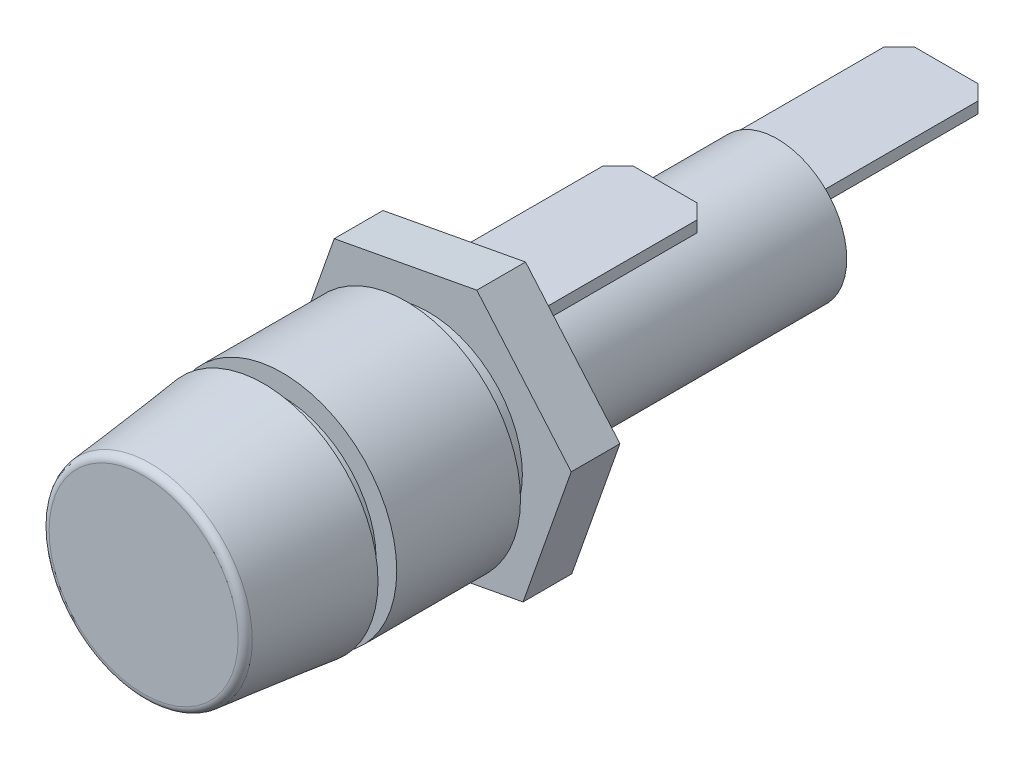
ISO-10303-21;
HEADER;
FILE_DESCRIPTION(('STEP AP214'),'2;1');
FILE_NAME('part.step','',(''),(''),'','','');
FILE_SCHEMA(('AUTOMOTIVE_DESIGN { 1 0 10303 214 1 1 1 1 }'));
ENDSEC;
DATA;
#1=APPLICATION_CONTEXT('core data for automotive mechanical design processes');
#2=APPLICATION_PROTOCOL_DEFINITION('international standard','automotive_design',2000,#1);
#3=PRODUCT_CONTEXT('',#1,'mechanical');
#4=PRODUCT('Part','Part','',(#3));
#5=PRODUCT_RELATED_PRODUCT_CATEGORY('part','',(#4));
#6=PRODUCT_DEFINITION_FORMATION('','',#4);
#7=PRODUCT_DEFINITION_CONTEXT('part definition',#1,'design');
#8=PRODUCT_DEFINITION('design','',#6,#7);
#9=PRODUCT_DEFINITION_SHAPE('','',#8);
#10=(LENGTH_UNIT() NAMED_UNIT(*) SI_UNIT(.MILLI.,.METRE.));
#11=(NAMED_UNIT(*) PLANE_ANGLE_UNIT() SI_UNIT($,.RADIAN.));
#12=(NAMED_UNIT(*) SI_UNIT($,.STERADIAN.) SOLID_ANGLE_UNIT());
#13=UNCERTAINTY_MEASURE_WITH_UNIT(LENGTH_MEASURE(1.E-05),#10,'distance_accuracy_value','');
#14=(GEOMETRIC_REPRESENTATION_CONTEXT(3) GLOBAL_UNCERTAINTY_ASSIGNED_CONTEXT((#13)) GLOBAL_UNIT_ASSIGNED_CONTEXT((#10,
#11,#12)) REPRESENTATION_CONTEXT('',''));
#15=CARTESIAN_POINT('',(0.,0.,0.));
#16=DIRECTION('',(0.,0.,1.));
#17=DIRECTION('',(1.,0.,0.));
#18=AXIS2_PLACEMENT_3D('',#15,#16,#17);
#19=CARTESIAN_POINT('',(6.35,0.,-6.096));
#20=DIRECTION('',(0.,0.,-1.));
#21=DIRECTION('',(-1.,0.,0.));
#22=AXIS2_PLACEMENT_3D('',#19,#20,#21);
#23=PLANE('',#22);
#24=CARTESIAN_POINT('',(0.,0.,-6.096));
#25=DIRECTION('',(0.,0.,1.));
#26=DIRECTION('',(1.,0.,0.));
#27=AXIS2_PLACEMENT_3D('',#24,#25,#26);
#28=CIRCLE('',#27,4.699);
#29=CARTESIAN_POINT('',(4.699,0.,-6.096));
#30=VERTEX_POINT('',#29);
#31=EDGE_CURVE('E310',#30,#30,#28,.T.);
#32=ORIENTED_EDGE('',*,*,#31,.T.);
#33=EDGE_LOOP('',(#32));
#34=FACE_BOUND('',#33,.T.);
#35=DIRECTION('',(-1.,0.,0.));
#36=VECTOR('',#35,1.);
#37=CARTESIAN_POINT('',(3.175,5.08,-6.09600000001365));
#38=LINE('',#37,#36);
#39=CARTESIAN_POINT('',(3.175,5.08,-6.09600000001365));
#40=VERTEX_POINT('',#39);
#41=CARTESIAN_POINT('',(-3.175,5.08,-6.09600000001365));
#42=VERTEX_POINT('',#41);
#43=EDGE_CURVE('E172',#40,#42,#38,.T.);
#44=ORIENTED_EDGE('',*,*,#43,.F.);
#45=DIRECTION('',(0.,-1.,0.));
#46=VECTOR('',#45,1.);
#47=CARTESIAN_POINT('',(3.175,5.08,-6.09600000001365));
#48=LINE('',#47,#46);
#49=CARTESIAN_POINT('',(3.175,5.49926131403118,-6.09600000001365));
#50=VERTEX_POINT('',#49);
#51=EDGE_CURVE('E183',#50,#40,#48,.T.);
#52=ORIENTED_EDGE('',*,*,#51,.F.);
#53=CARTESIAN_POINT('',(0.,0.,-6.096));
#54=DIRECTION('',(0.,0.,1.));
#55=DIRECTION('',(1.,0.,0.));
#56=AXIS2_PLACEMENT_3D('',#53,#54,#55);
#57=CIRCLE('',#56,6.35);
#58=CARTESIAN_POINT('',(-3.175,5.49926131403118,-6.09600000001365));
#59=VERTEX_POINT('',#58);
#60=EDGE_CURVE('E306',#59,#50,#57,.T.);
#61=ORIENTED_EDGE('',*,*,#60,.F.);
#62=DIRECTION('',(0.,1.,0.));
#63=VECTOR('',#62,1.);
#64=CARTESIAN_POINT('',(-3.175,5.08,-6.09600000001365));
#65=LINE('',#64,#63);
#66=EDGE_CURVE('E192',#42,#59,#65,.T.);
#67=ORIENTED_EDGE('',*,*,#66,.F.);
#68=EDGE_LOOP('',(#44,#52,#61,#67));
#69=FACE_BOUND('',#68,.T.);
#70=ADVANCED_FACE('F30',(#34,#69),#23,.T.);
#71=CARTESIAN_POINT('',(2.48868157866771,5.842,-6.096));
#72=VERTEX_POINT('',#71);
#73=CARTESIAN_POINT('',(-2.48868157866771,5.842,-6.09600000001365));
#74=VERTEX_POINT('',#73);
#75=EDGE_CURVE('E311',#72,#74,#57,.T.);
#76=ORIENTED_EDGE('',*,*,#75,.F.);
#77=DIRECTION('',(1.,0.,0.));
#78=VECTOR('',#77,1.);
#79=CARTESIAN_POINT('',(3.175,5.842,-6.09600000001365));
#80=LINE('',#79,#78);
#81=EDGE_CURVE('E203',#74,#72,#80,.T.);
#82=ORIENTED_EDGE('',*,*,#81,.F.);
#83=EDGE_LOOP('',(#76,#82));
#84=FACE_BOUND('',#83,.T.);
#85=ADVANCED_FACE('F389',(#84),#23,.T.);
#86=CARTESIAN_POINT('',(4.699,0.,-25.146));
#87=DIRECTION('',(0.,0.,-1.));
#88=DIRECTION('',(-1.,0.,0.));
#89=AXIS2_PLACEMENT_3D('',#86,#87,#88);
#90=PLANE('',#89);
#91=CARTESIAN_POINT('',(0.,0.,-25.146));
#92=DIRECTION('',(0.,0.,1.));
#93=DIRECTION('',(1.,0.,0.));
#94=AXIS2_PLACEMENT_3D('',#91,#92,#93);
#95=CIRCLE('',#94,4.699);
#96=CARTESIAN_POINT('',(4.699,0.,-25.146));
#97=VERTEX_POINT('',#96);
#98=EDGE_CURVE('E314',#97,#97,#95,.T.);
#99=ORIENTED_EDGE('',*,*,#98,.F.);
#100=EDGE_LOOP('',(#99));
#101=FACE_BOUND('',#100,.T.);
#102=DIRECTION('',(-1.,0.,0.));
#103=VECTOR('',#102,1.);
#104=CARTESIAN_POINT('',(3.175,2.54,-25.146));
#105=LINE('',#104,#103);
#106=CARTESIAN_POINT('',(3.175,2.54,-25.146));
#107=VERTEX_POINT('',#106);
#108=CARTESIAN_POINT('',(-3.175,2.54,-25.146));
#109=VERTEX_POINT('',#108);
#110=EDGE_CURVE('E216',#107,#109,#105,.T.);
#111=ORIENTED_EDGE('',*,*,#110,.F.);
#112=DIRECTION('',(0.,-1.,0.));
#113=VECTOR('',#112,1.);
#114=CARTESIAN_POINT('',(3.175,2.54,-25.146));
#115=LINE('',#114,#113);
#116=CARTESIAN_POINT('',(3.175,3.302,-25.146));
#117=VERTEX_POINT('',#116);
#118=EDGE_CURVE('E178',#117,#107,#115,.T.);
#119=ORIENTED_EDGE('',*,*,#118,.F.);
#120=DIRECTION('',(1.,0.,0.));
#121=VECTOR('',#120,1.);
#122=CARTESIAN_POINT('',(3.175,3.302,-25.146));
#123=LINE('',#122,#121);
#124=CARTESIAN_POINT('',(-3.175,3.302,-25.146));
#125=VERTEX_POINT('',#124);
#126=EDGE_CURVE('E222',#125,#117,#123,.T.);
#127=ORIENTED_EDGE('',*,*,#126,.F.);
#128=DIRECTION('',(0.,1.,0.));
#129=VECTOR('',#128,1.);
#130=CARTESIAN_POINT('',(-3.175,2.54,-25.146));
#131=LINE('',#130,#129);
#132=EDGE_CURVE('E219',#109,#125,#131,.T.);
#133=ORIENTED_EDGE('',*,*,#132,.F.);
#134=EDGE_LOOP('',(#111,#119,#127,#133));
#135=FACE_BOUND('',#134,.T.);
#136=ADVANCED_FACE('F32',(#101,#135),#90,.T.);
#137=CARTESIAN_POINT('',(0.,0.,0.));
#138=DIRECTION('',(0.,0.,1.));
#139=DIRECTION('',(1.,0.,0.));
#140=AXIS2_PLACEMENT_3D('',#137,#138,#139);
#141=CYLINDRICAL_SURFACE('',#140,6.35);
#142=CARTESIAN_POINT('',(0.,0.,-1.524));
#143=DIRECTION('',(0.,0.,1.));
#144=DIRECTION('',(1.,0.,0.));
#145=AXIS2_PLACEMENT_3D('',#142,#143,#144);
#146=CIRCLE('',#145,6.35);
#147=CARTESIAN_POINT('',(6.35,0.,-1.524));
#148=VERTEX_POINT('',#147);
#149=EDGE_CURVE('E317',#148,#148,#146,.F.);
#150=ORIENTED_EDGE('',*,*,#149,.F.);
#151=EDGE_LOOP('',(#150));
#152=FACE_BOUND('',#151,.T.);
#153=CARTESIAN_POINT('',(0.,0.,0.));
#154=DIRECTION('',(0.,0.,1.));
#155=DIRECTION('',(1.,0.,0.));
#156=AXIS2_PLACEMENT_3D('',#153,#154,#155);
#157=CIRCLE('',#156,6.35);
#158=CARTESIAN_POINT('',(6.35,0.,0.));
#159=VERTEX_POINT('',#158);
#160=EDGE_CURVE('E303',#159,#159,#157,.T.);
#161=ORIENTED_EDGE('',*,*,#160,.F.);
#162=EDGE_LOOP('',(#161));
#163=FACE_BOUND('',#162,.T.);
#164=ADVANCED_FACE('F397',(#152,#163),#141,.T.);
#165=CARTESIAN_POINT('',(7.747,0.,0.));
#166=DIRECTION('',(0.,0.,-1.));
#167=DIRECTION('',(-1.,0.,0.));
#168=AXIS2_PLACEMENT_3D('',#165,#166,#167);
#169=PLANE('',#168);
#170=ORIENTED_EDGE('',*,*,#160,.T.);
#171=EDGE_LOOP('',(#170));
#172=FACE_BOUND('',#171,.T.);
#173=CARTESIAN_POINT('',(0.,0.,0.));
#174=DIRECTION('',(0.,0.,1.));
#175=DIRECTION('',(1.,0.,0.));
#176=AXIS2_PLACEMENT_3D('',#173,#174,#175);
#177=CIRCLE('',#176,7.747);
#178=CARTESIAN_POINT('',(7.747,0.,0.));
#179=VERTEX_POINT('',#178);
#180=EDGE_CURVE('E300',#179,#179,#177,.T.);
#181=ORIENTED_EDGE('',*,*,#180,.F.);
#182=EDGE_LOOP('',(#181));
#183=FACE_BOUND('',#182,.T.);
#184=ADVANCED_FACE('F421',(#172,#183),#169,.T.);
#185=CARTESIAN_POINT('',(0.,0.,0.));
#186=DIRECTION('',(0.,0.,1.));
#187=DIRECTION('',(1.,0.,0.));
#188=AXIS2_PLACEMENT_3D('',#185,#186,#187);
#189=CYLINDRICAL_SURFACE('',#188,7.747);
#190=ORIENTED_EDGE('',*,*,#180,.T.);
#191=EDGE_LOOP('',(#190));
#192=FACE_BOUND('',#191,.T.);
#193=CARTESIAN_POINT('',(0.,0.,8.382));
#194=DIRECTION('',(0.,0.,1.));
#195=DIRECTION('',(1.,0.,0.));
#196=AXIS2_PLACEMENT_3D('',#193,#194,#195);
#197=CIRCLE('',#196,7.747);
#198=CARTESIAN_POINT('',(7.747,0.,8.382));
#199=VERTEX_POINT('',#198);
#200=EDGE_CURVE('E297',#199,#199,#197,.T.);
#201=ORIENTED_EDGE('',*,*,#200,.F.);
#202=EDGE_LOOP('',(#201));
#203=FACE_BOUND('',#202,.T.);
#204=ADVANCED_FACE('F426',(#192,#203),#189,.T.);
#205=CARTESIAN_POINT('',(6.35,0.,8.382));
#206=DIRECTION('',(0.,0.,1.));
#207=DIRECTION('',(1.,0.,0.));
#208=AXIS2_PLACEMENT_3D('',#205,#206,#207);
#209=PLANE('',#208);
#210=ORIENTED_EDGE('',*,*,#200,.T.);
#211=EDGE_LOOP('',(#210));
#212=FACE_BOUND('',#211,.T.);
#213=CARTESIAN_POINT('',(0.,0.,8.382));
#214=DIRECTION('',(0.,0.,1.));
#215=DIRECTION('',(1.,0.,0.));
#216=AXIS2_PLACEMENT_3D('',#213,#214,#215);
#217=CIRCLE('',#216,6.35);
#218=CARTESIAN_POINT('',(6.35,0.,8.382));
#219=VERTEX_POINT('',#218);
#220=EDGE_CURVE('E294',#219,#219,#217,.T.);
#221=ORIENTED_EDGE('',*,*,#220,.F.);
#222=EDGE_LOOP('',(#221));
#223=FACE_BOUND('',#222,.T.);
#224=ADVANCED_FACE('F436',(#212,#223),#209,.T.);
#225=CARTESIAN_POINT('',(0.,0.,0.));
#226=DIRECTION('',(0.,0.,1.));
#227=DIRECTION('',(1.,0.,0.));
#228=AXIS2_PLACEMENT_3D('',#225,#226,#227);
#229=CYLINDRICAL_SURFACE('',#228,6.35);
#230=ORIENTED_EDGE('',*,*,#220,.T.);
#231=EDGE_LOOP('',(#230));
#232=FACE_BOUND('',#231,.T.);
#233=CARTESIAN_POINT('',(0.,0.,9.65199999999988));
#234=DIRECTION('',(0.,0.,1.));
#235=DIRECTION('',(1.,0.,0.));
#236=AXIS2_PLACEMENT_3D('',#233,#234,#235);
#237=CIRCLE('',#236,6.35);
#238=CARTESIAN_POINT('',(6.35,0.,9.65199999999988));
#239=VERTEX_POINT('',#238);
#240=EDGE_CURVE('E291',#239,#239,#237,.T.);
#241=ORIENTED_EDGE('',*,*,#240,.F.);
#242=EDGE_LOOP('',(#241));
#243=FACE_BOUND('',#242,.T.);
#244=ADVANCED_FACE('F442',(#232,#243),#229,.T.);
#245=CARTESIAN_POINT('',(7.747,0.,9.65199999999988));
#246=DIRECTION('',(0.,0.,-1.));
#247=DIRECTION('',(-1.,0.,0.));
#248=AXIS2_PLACEMENT_3D('',#245,#246,#247);
#249=PLANE('',#248);
#250=ORIENTED_EDGE('',*,*,#240,.T.);
#251=EDGE_LOOP('',(#250));
#252=FACE_BOUND('',#251,.T.);
#253=CARTESIAN_POINT('',(0.,0.,9.65199999999988));
#254=DIRECTION('',(0.,0.,1.));
#255=DIRECTION('',(1.,0.,0.));
#256=AXIS2_PLACEMENT_3D('',#253,#254,#255);
#257=CIRCLE('',#256,7.747);
#258=CARTESIAN_POINT('',(7.747,0.,9.65199999999988));
#259=VERTEX_POINT('',#258);
#260=EDGE_CURVE('E288',#259,#259,#257,.T.);
#261=ORIENTED_EDGE('',*,*,#260,.F.);
#262=EDGE_LOOP('',(#261));
#263=FACE_BOUND('',#262,.T.);
#264=ADVANCED_FACE('F448',(#252,#263),#249,.T.);
#265=CARTESIAN_POINT('',(0.,0.,17.7799999999999));
#266=DIRECTION('',(0.,0.,-1.));
#267=DIRECTION('',(-1.,0.,0.));
#268=AXIS2_PLACEMENT_3D('',#265,#266,#267);
#269=CONICAL_SURFACE('',#268,6.858,0.108941956989866);
#270=CARTESIAN_POINT('',(0.,0.,17.327233108373));
#271=DIRECTION('',(0.,0.,1.));
#272=DIRECTION('',(1.,0.,0.));
#273=AXIS2_PLACEMENT_3D('',#270,#271,#272);
#274=CIRCLE('',#273,6.90752137877169);
#275=CARTESIAN_POINT('',(6.90752137877169,0.,17.327233108373));
#276=VERTEX_POINT('',#275);
#277=EDGE_CURVE('E325',#276,#276,#274,.F.);
#278=ORIENTED_EDGE('',*,*,#277,.T.);
#279=EDGE_LOOP('',(#278));
#280=FACE_BOUND('',#279,.T.);
#281=ORIENTED_EDGE('',*,*,#260,.T.);
#282=EDGE_LOOP('',(#281));
#283=FACE_BOUND('',#282,.T.);
#284=ADVANCED_FACE('F454',(#280,#283),#269,.T.);
#285=CARTESIAN_POINT('',(0.,0.,17.7799999999999));
#286=DIRECTION('',(0.,0.,1.));
#287=DIRECTION('',(1.,0.,0.));
#288=AXIS2_PLACEMENT_3D('',#285,#286,#287);
#289=PLANE('',#288);
#290=CARTESIAN_POINT('',(0.,0.,17.7799999999999));
#291=DIRECTION('',(0.,0.,1.));
#292=DIRECTION('',(1.,0.,0.));
#293=AXIS2_PLACEMENT_3D('',#290,#291,#292);
#294=CIRCLE('',#293,6.40253295936047);
#295=CARTESIAN_POINT('',(6.40253295936047,0.,17.7799999999999));
#296=VERTEX_POINT('',#295);
#297=EDGE_CURVE('E322',#296,#296,#294,.T.);
#298=ORIENTED_EDGE('',*,*,#297,.T.);
#299=EDGE_LOOP('',(#298));
#300=FACE_BOUND('',#299,.T.);
#301=ADVANCED_FACE('F459',(#300),#289,.T.);
#302=CARTESIAN_POINT('',(9.65763992523248,1.80760405174629,-1.524));
#303=DIRECTION('',(0.94323016315928,-0.33213981891143,0.));
#304=DIRECTION('',(0.33213981891143,0.94323016315928,0.));
#305=AXIS2_PLACEMENT_3D('',#302,#303,#304);
#306=PLANE('',#305);
#307=DIRECTION('',(-0.33213981891143,-0.94323016315928,0.));
#308=VECTOR('',#307,1.);
#309=CARTESIAN_POINT('',(9.65763992523248,1.80760405174629,-4.826));
#310=LINE('',#309,#308);
#311=CARTESIAN_POINT('',(9.65763992523248,1.80760405174629,-4.826));
#312=VERTEX_POINT('',#311);
#313=CARTESIAN_POINT('',(6.39425099141221,-7.45995948998103,-4.826));
#314=VERTEX_POINT('',#313);
#315=EDGE_CURVE('E239',#312,#314,#310,.T.);
#316=ORIENTED_EDGE('',*,*,#315,.F.);
#317=DIRECTION('',(0.,0.,-1.));
#318=VECTOR('',#317,1.);
#319=CARTESIAN_POINT('',(9.65763992523248,1.80760405174629,-1.524));
#320=LINE('',#319,#318);
#321=CARTESIAN_POINT('',(9.65763992523248,1.80760405174629,-1.524));
#322=VERTEX_POINT('',#321);
#323=EDGE_CURVE('E276',#322,#312,#320,.T.);
#324=ORIENTED_EDGE('',*,*,#323,.F.);
#325=DIRECTION('',(-0.33213981891143,-0.94323016315928,0.));
#326=VECTOR('',#325,1.);
#327=CARTESIAN_POINT('',(9.65763992523248,1.80760405174629,-1.524));
#328=LINE('',#327,#326);
#329=CARTESIAN_POINT('',(6.39425099141221,-7.45995948998103,-1.524));
#330=VERTEX_POINT('',#329);
#331=EDGE_CURVE('E257',#322,#330,#328,.T.);
#332=ORIENTED_EDGE('',*,*,#331,.T.);
#333=DIRECTION('',(0.,0.,-1.));
#334=VECTOR('',#333,1.);
#335=CARTESIAN_POINT('',(6.39425099141221,-7.45995948998103,-1.524));
#336=LINE('',#335,#334);
#337=EDGE_CURVE('E275',#330,#314,#336,.T.);
#338=ORIENTED_EDGE('',*,*,#337,.T.);
#339=EDGE_LOOP('',(#316,#324,#332,#338));
#340=FACE_BOUND('',#339,.T.);
#341=ADVANCED_FACE('F465',(#340),#306,.T.);
#342=CARTESIAN_POINT('',(3.26338893382028,9.26756354172732,-1.524));
#343=DIRECTION('',(0.759256602365302,0.650791373455962,0.));
#344=DIRECTION('',(-0.650791373455962,0.759256602365302,0.));
#345=AXIS2_PLACEMENT_3D('',#342,#343,#344);
#346=PLANE('',#345);
#347=DIRECTION('',(0.650791373455962,-0.759256602365302,0.));
#348=VECTOR('',#347,1.);
#349=CARTESIAN_POINT('',(3.26338893382028,9.26756354172732,-4.826));
#350=LINE('',#349,#348);
#351=CARTESIAN_POINT('',(3.26338893382028,9.26756354172732,-4.826));
#352=VERTEX_POINT('',#351);
#353=EDGE_CURVE('E254',#352,#312,#350,.T.);
#354=ORIENTED_EDGE('',*,*,#353,.F.);
#355=DIRECTION('',(0.,0.,-1.));
#356=VECTOR('',#355,1.);
#357=CARTESIAN_POINT('',(3.26338893382028,9.26756354172732,-1.524));
#358=LINE('',#357,#356);
#359=CARTESIAN_POINT('',(3.26338893382028,9.26756354172732,-1.524));
#360=VERTEX_POINT('',#359);
#361=EDGE_CURVE('E279',#360,#352,#358,.T.);
#362=ORIENTED_EDGE('',*,*,#361,.F.);
#363=DIRECTION('',(0.650791373455962,-0.759256602365302,0.));
#364=VECTOR('',#363,1.);
#365=CARTESIAN_POINT('',(3.26338893382028,9.26756354172732,-1.524));
#366=LINE('',#365,#364);
#367=EDGE_CURVE('E272',#360,#322,#366,.T.);
#368=ORIENTED_EDGE('',*,*,#367,.T.);
#369=ORIENTED_EDGE('',*,*,#323,.T.);
#370=EDGE_LOOP('',(#354,#362,#368,#369));
#371=FACE_BOUND('',#370,.T.);
#372=ADVANCED_FACE('F471',(#371),#346,.T.);
#373=CARTESIAN_POINT('',(-6.39425099141221,7.45995948998103,-1.524));
#374=DIRECTION('',(-0.183973560793978,0.982931192367393,0.));
#375=DIRECTION('',(-0.982931192367393,-0.183973560793978,0.));
#376=AXIS2_PLACEMENT_3D('',#373,#374,#375);
#377=PLANE('',#376);
#378=DIRECTION('',(0.982931192367393,0.183973560793978,0.));
#379=VECTOR('',#378,1.);
#380=CARTESIAN_POINT('',(-6.39425099141221,7.45995948998103,-4.826));
#381=LINE('',#380,#379);
#382=CARTESIAN_POINT('',(-6.39425099141221,7.45995948998103,-4.826));
#383=VERTEX_POINT('',#382);
#384=EDGE_CURVE('E251',#383,#352,#381,.T.);
#385=ORIENTED_EDGE('',*,*,#384,.F.);
#386=DIRECTION('',(0.,0.,-1.));
#387=VECTOR('',#386,1.);
#388=CARTESIAN_POINT('',(-6.39425099141221,7.45995948998103,-1.524));
#389=LINE('',#388,#387);
#390=CARTESIAN_POINT('',(-6.39425099141221,7.45995948998103,-1.524));
#391=VERTEX_POINT('',#390);
#392=EDGE_CURVE('E281',#391,#383,#389,.T.);
#393=ORIENTED_EDGE('',*,*,#392,.F.);
#394=DIRECTION('',(0.982931192367393,0.183973560793978,0.));
#395=VECTOR('',#394,1.);
#396=CARTESIAN_POINT('',(-6.39425099141221,7.45995948998103,-1.524));
#397=LINE('',#396,#395);
#398=EDGE_CURVE('E269',#391,#360,#397,.T.);
#399=ORIENTED_EDGE('',*,*,#398,.T.);
#400=ORIENTED_EDGE('',*,*,#361,.T.);
#401=EDGE_LOOP('',(#385,#393,#399,#400));
#402=FACE_BOUND('',#401,.T.);
#403=ADVANCED_FACE('F484',(#402),#377,.T.);
#404=CARTESIAN_POINT('',(-9.65763992523248,-1.80760405174629,-1.524));
#405=DIRECTION('',(-0.94323016315928,0.33213981891143,0.));
#406=DIRECTION('',(-0.33213981891143,-0.94323016315928,0.));
#407=AXIS2_PLACEMENT_3D('',#404,#405,#406);
#408=PLANE('',#407);
#409=DIRECTION('',(0.33213981891143,0.94323016315928,0.));
#410=VECTOR('',#409,1.);
#411=CARTESIAN_POINT('',(-9.65763992523248,-1.80760405174629,-4.826));
#412=LINE('',#411,#410);
#413=CARTESIAN_POINT('',(-9.65763992523248,-1.80760405174629,-4.826));
#414=VERTEX_POINT('',#413);
#415=EDGE_CURVE('E248',#414,#383,#412,.T.);
#416=ORIENTED_EDGE('',*,*,#415,.F.);
#417=DIRECTION('',(0.,0.,-1.));
#418=VECTOR('',#417,1.);
#419=CARTESIAN_POINT('',(-9.65763992523248,-1.80760405174629,-1.524));
#420=LINE('',#419,#418);
#421=CARTESIAN_POINT('',(-9.65763992523248,-1.80760405174629,-1.524));
#422=VERTEX_POINT('',#421);
#423=EDGE_CURVE('E283',#422,#414,#420,.T.);
#424=ORIENTED_EDGE('',*,*,#423,.F.);
#425=DIRECTION('',(0.33213981891143,0.94323016315928,0.));
#426=VECTOR('',#425,1.);
#427=CARTESIAN_POINT('',(-9.65763992523248,-1.80760405174629,-1.524));
#428=LINE('',#427,#426);
#429=EDGE_CURVE('E266',#422,#391,#428,.T.);
#430=ORIENTED_EDGE('',*,*,#429,.T.);
#431=ORIENTED_EDGE('',*,*,#392,.T.);
#432=EDGE_LOOP('',(#416,#424,#430,#431));
#433=FACE_BOUND('',#432,.T.);
#434=ADVANCED_FACE('F480',(#433),#408,.T.);
#435=CARTESIAN_POINT('',(-3.26338893382027,-9.26756354172732,-1.524));
#436=DIRECTION('',(-0.759256602365302,-0.650791373455962,0.));
#437=DIRECTION('',(0.650791373455962,-0.759256602365302,0.));
#438=AXIS2_PLACEMENT_3D('',#435,#436,#437);
#439=PLANE('',#438);
#440=DIRECTION('',(-0.650791373455962,0.759256602365302,0.));
#441=VECTOR('',#440,1.);
#442=CARTESIAN_POINT('',(-3.26338893382027,-9.26756354172732,-4.826));
#443=LINE('',#442,#441);
#444=CARTESIAN_POINT('',(-3.26338893382027,-9.26756354172732,-4.826));
#445=VERTEX_POINT('',#444);
#446=EDGE_CURVE('E245',#445,#414,#443,.T.);
#447=ORIENTED_EDGE('',*,*,#446,.F.);
#448=DIRECTION('',(0.,0.,-1.));
#449=VECTOR('',#448,1.);
#450=CARTESIAN_POINT('',(-3.26338893382027,-9.26756354172732,-1.524));
#451=LINE('',#450,#449);
#452=CARTESIAN_POINT('',(-3.26338893382027,-9.26756354172732,-1.524));
#453=VERTEX_POINT('',#452);
#454=EDGE_CURVE('E285',#453,#445,#451,.T.);
#455=ORIENTED_EDGE('',*,*,#454,.F.);
#456=DIRECTION('',(-0.650791373455962,0.759256602365302,0.));
#457=VECTOR('',#456,1.);
#458=CARTESIAN_POINT('',(-3.26338893382027,-9.26756354172732,-1.524));
#459=LINE('',#458,#457);
#460=EDGE_CURVE('E263',#453,#422,#459,.T.);
#461=ORIENTED_EDGE('',*,*,#460,.T.);
#462=ORIENTED_EDGE('',*,*,#423,.T.);
#463=EDGE_LOOP('',(#447,#455,#461,#462));
#464=FACE_BOUND('',#463,.T.);
#465=ADVANCED_FACE('F476',(#464),#439,.T.);
#466=CARTESIAN_POINT('',(6.39425099141221,-7.45995948998103,-1.524));
#467=DIRECTION('',(0.183973560793978,-0.982931192367393,0.));
#468=DIRECTION('',(0.982931192367393,0.183973560793978,0.));
#469=AXIS2_PLACEMENT_3D('',#466,#467,#468);
#470=PLANE('',#469);
#471=DIRECTION('',(-0.982931192367393,-0.183973560793978,0.));
#472=VECTOR('',#471,1.);
#473=CARTESIAN_POINT('',(6.39425099141221,-7.45995948998103,-4.826));
#474=LINE('',#473,#472);
#475=EDGE_CURVE('E242',#314,#445,#474,.T.);
#476=ORIENTED_EDGE('',*,*,#475,.F.);
#477=ORIENTED_EDGE('',*,*,#337,.F.);
#478=DIRECTION('',(-0.982931192367393,-0.183973560793978,0.));
#479=VECTOR('',#478,1.);
#480=CARTESIAN_POINT('',(6.39425099141221,-7.45995948998103,-1.524));
#481=LINE('',#480,#479);
#482=EDGE_CURVE('E260',#330,#453,#481,.T.);
#483=ORIENTED_EDGE('',*,*,#482,.T.);
#484=ORIENTED_EDGE('',*,*,#454,.T.);
#485=EDGE_LOOP('',(#476,#477,#483,#484));
#486=FACE_BOUND('',#485,.T.);
#487=ADVANCED_FACE('F473',(#486),#470,.T.);
#488=CARTESIAN_POINT('',(12.9210288590528,11.0751675934736,-1.524));
#489=DIRECTION('',(0.,0.,1.));
#490=DIRECTION('',(1.,0.,0.));
#491=AXIS2_PLACEMENT_3D('',#488,#489,#490);
#492=PLANE('',#491);
#493=ORIENTED_EDGE('',*,*,#149,.T.);
#494=EDGE_LOOP('',(#493));
#495=FACE_BOUND('',#494,.T.);
#496=ORIENTED_EDGE('',*,*,#331,.F.);
#497=ORIENTED_EDGE('',*,*,#367,.F.);
#498=ORIENTED_EDGE('',*,*,#398,.F.);
#499=ORIENTED_EDGE('',*,*,#429,.F.);
#500=ORIENTED_EDGE('',*,*,#460,.F.);
#501=ORIENTED_EDGE('',*,*,#482,.F.);
#502=EDGE_LOOP('',(#496,#497,#498,#499,#500,#501));
#503=FACE_BOUND('',#502,.T.);
#504=ADVANCED_FACE('F410',(#495,#503),#492,.T.);
#505=CARTESIAN_POINT('',(12.9210288590528,11.0751675934736,-4.826));
#506=DIRECTION('',(0.,0.,1.));
#507=DIRECTION('',(1.,0.,0.));
#508=AXIS2_PLACEMENT_3D('',#505,#506,#507);
#509=PLANE('',#508);
#510=CARTESIAN_POINT('',(0.,0.,-4.826));
#511=DIRECTION('',(0.,0.,1.));
#512=DIRECTION('',(1.,0.,0.));
#513=AXIS2_PLACEMENT_3D('',#510,#511,#512);
#514=CIRCLE('',#513,6.35);
#515=CARTESIAN_POINT('',(6.35,0.,-4.826));
#516=VERTEX_POINT('',#515);
#517=EDGE_CURVE('E278',#516,#516,#514,.F.);
#518=ORIENTED_EDGE('',*,*,#517,.F.);
#519=EDGE_LOOP('',(#518));
#520=FACE_BOUND('',#519,.T.);
#521=ORIENTED_EDGE('',*,*,#315,.T.);
#522=ORIENTED_EDGE('',*,*,#475,.T.);
#523=ORIENTED_EDGE('',*,*,#446,.T.);
#524=ORIENTED_EDGE('',*,*,#415,.T.);
#525=ORIENTED_EDGE('',*,*,#384,.T.);
#526=ORIENTED_EDGE('',*,*,#353,.T.);
#527=EDGE_LOOP('',(#521,#522,#523,#524,#525,#526));
#528=FACE_BOUND('',#527,.T.);
#529=ADVANCED_FACE('F402',(#520,#528),#509,.F.);
#530=CARTESIAN_POINT('',(0.,0.,0.));
#531=DIRECTION('',(0.,0.,1.));
#532=DIRECTION('',(1.,0.,0.));
#533=AXIS2_PLACEMENT_3D('',#530,#531,#532);
#534=CYLINDRICAL_SURFACE('',#533,4.699);
#535=ORIENTED_EDGE('',*,*,#98,.T.);
#536=EDGE_LOOP('',(#535));
#537=FACE_BOUND('',#536,.T.);
#538=ORIENTED_EDGE('',*,*,#31,.F.);
#539=EDGE_LOOP('',(#538));
#540=FACE_BOUND('',#539,.T.);
#541=ADVANCED_FACE('F399',(#537,#540),#534,.T.);
#542=EDGE_CURVE('E307',#50,#72,#57,.T.);
#543=ORIENTED_EDGE('',*,*,#542,.T.);
#544=ORIENTED_EDGE('',*,*,#75,.T.);
#545=EDGE_CURVE('E644',#74,#59,#57,.T.);
#546=ORIENTED_EDGE('',*,*,#545,.T.);
#547=ORIENTED_EDGE('',*,*,#60,.T.);
#548=EDGE_LOOP('',(#543,#544,#546,#547));
#549=FACE_BOUND('',#548,.T.);
#550=ORIENTED_EDGE('',*,*,#517,.T.);
#551=EDGE_LOOP('',(#550));
#552=FACE_BOUND('',#551,.T.);
#553=ADVANCED_FACE('F401',(#549,#552),#141,.T.);
#554=CARTESIAN_POINT('',(0.,0.,17.2719999999999));
#555=DIRECTION('',(0.,0.,1.));
#556=DIRECTION('',(1.,0.,0.));
#557=AXIS2_PLACEMENT_3D('',#554,#555,#556);
#558=TOROIDAL_SURFACE('',#557,6.40253295936047,0.508);
#559=ORIENTED_EDGE('',*,*,#277,.F.);
#560=EDGE_LOOP('',(#559));
#561=FACE_BOUND('',#560,.T.);
#562=ORIENTED_EDGE('',*,*,#297,.F.);
#563=EDGE_LOOP('',(#562));
#564=FACE_BOUND('',#563,.T.);
#565=ADVANCED_FACE('F408',(#561,#564),#558,.T.);
#566=CARTESIAN_POINT('',(3.175,2.54,-36.576));
#567=DIRECTION('',(-1.,0.,0.));
#568=DIRECTION('',(0.,0.,1.));
#569=AXIS2_PLACEMENT_3D('',#566,#567,#568);
#570=PLANE('',#569);
#571=DIRECTION('',(0.,0.,1.));
#572=VECTOR('',#571,1.);
#573=CARTESIAN_POINT('',(3.175,2.54,-36.576));
#574=LINE('',#573,#572);
#575=CARTESIAN_POINT('',(3.175,2.54,-35.56));
#576=VERTEX_POINT('',#575);
#577=EDGE_CURVE('E237',#576,#107,#574,.T.);
#578=ORIENTED_EDGE('',*,*,#577,.F.);
#579=DIRECTION('',(0.,1.,0.));
#580=VECTOR('',#579,1.);
#581=CARTESIAN_POINT('',(3.175,2.54,-35.56));
#582=LINE('',#581,#580);
#583=CARTESIAN_POINT('',(3.175,3.302,-35.56));
#584=VERTEX_POINT('',#583);
#585=EDGE_CURVE('E53',#576,#584,#582,.T.);
#586=ORIENTED_EDGE('',*,*,#585,.T.);
#587=DIRECTION('',(0.,0.,1.));
#588=VECTOR('',#587,1.);
#589=CARTESIAN_POINT('',(3.175,3.302,-36.576));
#590=LINE('',#589,#588);
#591=EDGE_CURVE('E231',#584,#117,#590,.T.);
#592=ORIENTED_EDGE('',*,*,#591,.T.);
#593=ORIENTED_EDGE('',*,*,#118,.T.);
#594=EDGE_LOOP('',(#578,#586,#592,#593));
#595=FACE_BOUND('',#594,.T.);
#596=ADVANCED_FACE('F367',(#595),#570,.F.);
#597=CARTESIAN_POINT('',(3.175,2.54,-36.576));
#598=DIRECTION('',(0.,1.,0.));
#599=DIRECTION('',(0.,0.,1.));
#600=AXIS2_PLACEMENT_3D('',#597,#598,#599);
#601=PLANE('',#600);
#602=DIRECTION('',(-1.,0.,0.));
#603=VECTOR('',#602,1.);
#604=CARTESIAN_POINT('',(3.175,2.54,-36.576));
#605=LINE('',#604,#603);
#606=CARTESIAN_POINT('',(2.159,2.54,-36.576));
#607=VERTEX_POINT('',#606);
#608=CARTESIAN_POINT('',(-2.159,2.54,-36.576));
#609=VERTEX_POINT('',#608);
#610=EDGE_CURVE('E225',#607,#609,#605,.T.);
#611=ORIENTED_EDGE('',*,*,#610,.F.);
#612=DIRECTION('',(-0.707106781186545,0.,-0.70710678118655));
#613=VECTOR('',#612,1.);
#614=CARTESIAN_POINT('',(2.159,2.54,-36.576));
#615=LINE('',#614,#613);
#616=EDGE_CURVE('E353',#607,#576,#615,.F.);
#617=ORIENTED_EDGE('',*,*,#616,.T.);
#618=ORIENTED_EDGE('',*,*,#577,.T.);
#619=ORIENTED_EDGE('',*,*,#110,.T.);
#620=DIRECTION('',(0.,0.,1.));
#621=VECTOR('',#620,1.);
#622=CARTESIAN_POINT('',(-3.175,2.54,-36.576));
#623=LINE('',#622,#621);
#624=CARTESIAN_POINT('',(-3.175,2.54,-35.56));
#625=VERTEX_POINT('',#624);
#626=EDGE_CURVE('E235',#625,#109,#623,.T.);
#627=ORIENTED_EDGE('',*,*,#626,.F.);
#628=DIRECTION('',(-0.707106781186545,0.,0.70710678118655));
#629=VECTOR('',#628,1.);
#630=CARTESIAN_POINT('',(-2.159,2.54,-36.576));
#631=LINE('',#630,#629);
#632=EDGE_CURVE('E351',#625,#609,#631,.F.);
#633=ORIENTED_EDGE('',*,*,#632,.T.);
#634=EDGE_LOOP('',(#611,#617,#618,#619,#627,#633));
#635=FACE_BOUND('',#634,.T.);
#636=ADVANCED_FACE('F366',(#635),#601,.F.);
#637=CARTESIAN_POINT('',(-3.175,2.54,-36.576));
#638=DIRECTION('',(1.,0.,0.));
#639=DIRECTION('',(0.,0.,-1.));
#640=AXIS2_PLACEMENT_3D('',#637,#638,#639);
#641=PLANE('',#640);
#642=DIRECTION('',(0.,0.,1.));
#643=VECTOR('',#642,1.);
#644=CARTESIAN_POINT('',(-3.175,3.302,-36.576));
#645=LINE('',#644,#643);
#646=CARTESIAN_POINT('',(-3.175,3.302,-35.56));
#647=VERTEX_POINT('',#646);
#648=EDGE_CURVE('E233',#647,#125,#645,.T.);
#649=ORIENTED_EDGE('',*,*,#648,.F.);
#650=DIRECTION('',(0.,-1.,0.));
#651=VECTOR('',#650,1.);
#652=CARTESIAN_POINT('',(-3.175,2.54,-35.56));
#653=LINE('',#652,#651);
#654=EDGE_CURVE('E11',#647,#625,#653,.T.);
#655=ORIENTED_EDGE('',*,*,#654,.T.);
#656=ORIENTED_EDGE('',*,*,#626,.T.);
#657=ORIENTED_EDGE('',*,*,#132,.T.);
#658=EDGE_LOOP('',(#649,#655,#656,#657));
#659=FACE_BOUND('',#658,.T.);
#660=ADVANCED_FACE('F379',(#659),#641,.F.);
#661=CARTESIAN_POINT('',(3.175,3.302,-36.576));
#662=DIRECTION('',(0.,-1.,0.));
#663=DIRECTION('',(0.,0.,-1.));
#664=AXIS2_PLACEMENT_3D('',#661,#662,#663);
#665=PLANE('',#664);
#666=ORIENTED_EDGE('',*,*,#591,.F.);
#667=DIRECTION('',(0.707106781186545,0.,0.70710678118655));
#668=VECTOR('',#667,1.);
#669=CARTESIAN_POINT('',(2.159,3.302,-36.576));
#670=LINE('',#669,#668);
#671=CARTESIAN_POINT('',(2.159,3.302,-36.576));
#672=VERTEX_POINT('',#671);
#673=EDGE_CURVE('E38',#584,#672,#670,.F.);
#674=ORIENTED_EDGE('',*,*,#673,.T.);
#675=DIRECTION('',(1.,0.,0.));
#676=VECTOR('',#675,1.);
#677=CARTESIAN_POINT('',(3.175,3.302,-36.576));
#678=LINE('',#677,#676);
#679=CARTESIAN_POINT('',(-2.159,3.302,-36.576));
#680=VERTEX_POINT('',#679);
#681=EDGE_CURVE('E228',#680,#672,#678,.T.);
#682=ORIENTED_EDGE('',*,*,#681,.F.);
#683=DIRECTION('',(0.707106781186545,0.,-0.70710678118655));
#684=VECTOR('',#683,1.);
#685=CARTESIAN_POINT('',(-2.159,3.302,-36.576));
#686=LINE('',#685,#684);
#687=EDGE_CURVE('E45',#680,#647,#686,.F.);
#688=ORIENTED_EDGE('',*,*,#687,.T.);
#689=ORIENTED_EDGE('',*,*,#648,.T.);
#690=ORIENTED_EDGE('',*,*,#126,.T.);
#691=EDGE_LOOP('',(#666,#674,#682,#688,#689,#690));
#692=FACE_BOUND('',#691,.T.);
#693=ADVANCED_FACE('F357',(#692),#665,.F.);
#694=CARTESIAN_POINT('',(3.175,3.302,-36.576));
#695=DIRECTION('',(0.,0.,1.));
#696=DIRECTION('',(1.,0.,0.));
#697=AXIS2_PLACEMENT_3D('',#694,#695,#696);
#698=PLANE('',#697);
#699=ORIENTED_EDGE('',*,*,#681,.T.);
#700=DIRECTION('',(0.,-1.,0.));
#701=VECTOR('',#700,1.);
#702=CARTESIAN_POINT('',(2.159,3.302,-36.576));
#703=LINE('',#702,#701);
#704=EDGE_CURVE('E348',#672,#607,#703,.T.);
#705=ORIENTED_EDGE('',*,*,#704,.T.);
#706=ORIENTED_EDGE('',*,*,#610,.T.);
#707=DIRECTION('',(0.,1.,0.));
#708=VECTOR('',#707,1.);
#709=CARTESIAN_POINT('',(-2.159,3.302,-36.576));
#710=LINE('',#709,#708);
#711=EDGE_CURVE('E345',#609,#680,#710,.T.);
#712=ORIENTED_EDGE('',*,*,#711,.T.);
#713=EDGE_LOOP('',(#699,#705,#706,#712));
#714=FACE_BOUND('',#713,.T.);
#715=ADVANCED_FACE('F361',(#714),#698,.F.);
#716=CARTESIAN_POINT('',(3.175,5.842,-6.09600000001365));
#717=DIRECTION('',(0.,0.,1.));
#718=DIRECTION('',(1.,0.,0.));
#719=AXIS2_PLACEMENT_3D('',#716,#717,#718);
#720=PLANE('',#719);
#721=CARTESIAN_POINT('',(-3.175,5.842,-6.09600000001365));
#722=VERTEX_POINT('',#721);
#723=EDGE_CURVE('E193',#59,#722,#65,.T.);
#724=ORIENTED_EDGE('',*,*,#723,.F.);
#725=ORIENTED_EDGE('',*,*,#545,.F.);
#726=EDGE_CURVE('E199',#722,#74,#80,.T.);
#727=ORIENTED_EDGE('',*,*,#726,.F.);
#728=EDGE_LOOP('',(#724,#725,#727));
#729=FACE_BOUND('',#728,.T.);
#730=ADVANCED_FACE('F528',(#729),#720,.T.);
#731=CARTESIAN_POINT('',(3.175,5.08,-17.5260000000136));
#732=DIRECTION('',(-1.,0.,0.));
#733=DIRECTION('',(0.,0.,1.));
#734=AXIS2_PLACEMENT_3D('',#731,#732,#733);
#735=PLANE('',#734);
#736=DIRECTION('',(0.,0.,1.));
#737=VECTOR('',#736,1.);
#738=CARTESIAN_POINT('',(3.175,5.08,-17.5260000000136));
#739=LINE('',#738,#737);
#740=CARTESIAN_POINT('',(3.175,5.08,-16.5100000000136));
#741=VERTEX_POINT('',#740);
#742=EDGE_CURVE('E167',#741,#40,#739,.T.);
#743=ORIENTED_EDGE('',*,*,#742,.F.);
#744=DIRECTION('',(0.,1.,0.));
#745=VECTOR('',#744,1.);
#746=CARTESIAN_POINT('',(3.175,5.08,-16.5100000000136));
#747=LINE('',#746,#745);
#748=CARTESIAN_POINT('',(3.175,5.842,-16.5100000000136));
#749=VERTEX_POINT('',#748);
#750=EDGE_CURVE('E343',#741,#749,#747,.T.);
#751=ORIENTED_EDGE('',*,*,#750,.T.);
#752=DIRECTION('',(0.,0.,1.));
#753=VECTOR('',#752,1.);
#754=CARTESIAN_POINT('',(3.175,5.842,-17.5260000000136));
#755=LINE('',#754,#753);
#756=CARTESIAN_POINT('',(3.175,5.842,-6.09600000001365));
#757=VERTEX_POINT('',#756);
#758=EDGE_CURVE('E209',#749,#757,#755,.T.);
#759=ORIENTED_EDGE('',*,*,#758,.T.);
#760=EDGE_CURVE('E186',#757,#50,#48,.T.);
#761=ORIENTED_EDGE('',*,*,#760,.T.);
#762=ORIENTED_EDGE('',*,*,#51,.T.);
#763=EDGE_LOOP('',(#743,#751,#759,#761,#762));
#764=FACE_BOUND('',#763,.T.);
#765=ADVANCED_FACE('F184',(#764),#735,.F.);
#766=CARTESIAN_POINT('',(3.175,5.08,-17.5260000000136));
#767=DIRECTION('',(0.,1.,0.));
#768=DIRECTION('',(0.,0.,1.));
#769=AXIS2_PLACEMENT_3D('',#766,#767,#768);
#770=PLANE('',#769);
#771=DIRECTION('',(0.,0.,1.));
#772=VECTOR('',#771,1.);
#773=CARTESIAN_POINT('',(-3.175,5.08,-17.5260000000136));
#774=LINE('',#773,#772);
#775=CARTESIAN_POINT('',(-3.175,5.08,-16.5100000000136));
#776=VERTEX_POINT('',#775);
#777=EDGE_CURVE('E179',#776,#42,#774,.T.);
#778=ORIENTED_EDGE('',*,*,#777,.F.);
#779=DIRECTION('',(-0.707106781186546,0.,0.707106781186549));
#780=VECTOR('',#779,1.);
#781=CARTESIAN_POINT('',(-2.159,5.08,-17.5260000000136));
#782=LINE('',#781,#780);
#783=CARTESIAN_POINT('',(-2.159,5.08,-17.5260000000136));
#784=VERTEX_POINT('',#783);
#785=EDGE_CURVE('E341',#776,#784,#782,.F.);
#786=ORIENTED_EDGE('',*,*,#785,.T.);
#787=DIRECTION('',(-1.,0.,0.));
#788=VECTOR('',#787,1.);
#789=CARTESIAN_POINT('',(3.175,5.08,-17.5260000000136));
#790=LINE('',#789,#788);
#791=CARTESIAN_POINT('',(2.159,5.08,-17.5260000000136));
#792=VERTEX_POINT('',#791);
#793=EDGE_CURVE('E202',#792,#784,#790,.T.);
#794=ORIENTED_EDGE('',*,*,#793,.F.);
#795=DIRECTION('',(-0.707106781186546,0.,-0.707106781186549));
#796=VECTOR('',#795,1.);
#797=CARTESIAN_POINT('',(2.159,5.08,-17.5260000000136));
#798=LINE('',#797,#796);
#799=EDGE_CURVE('E175',#792,#741,#798,.F.);
#800=ORIENTED_EDGE('',*,*,#799,.T.);
#801=ORIENTED_EDGE('',*,*,#742,.T.);
#802=ORIENTED_EDGE('',*,*,#43,.T.);
#803=EDGE_LOOP('',(#778,#786,#794,#800,#801,#802));
#804=FACE_BOUND('',#803,.T.);
#805=ADVANCED_FACE('F170',(#804),#770,.F.);
#806=CARTESIAN_POINT('',(-3.175,5.08,-17.5260000000136));
#807=DIRECTION('',(1.,0.,0.));
#808=DIRECTION('',(0.,0.,-1.));
#809=AXIS2_PLACEMENT_3D('',#806,#807,#808);
#810=PLANE('',#809);
#811=DIRECTION('',(0.,0.,1.));
#812=VECTOR('',#811,1.);
#813=CARTESIAN_POINT('',(-3.175,5.842,-17.5260000000136));
#814=LINE('',#813,#812);
#815=CARTESIAN_POINT('',(-3.175,5.842,-16.5100000000136));
#816=VERTEX_POINT('',#815);
#817=EDGE_CURVE('E211',#816,#722,#814,.T.);
#818=ORIENTED_EDGE('',*,*,#817,.F.);
#819=DIRECTION('',(0.,-1.,0.));
#820=VECTOR('',#819,1.);
#821=CARTESIAN_POINT('',(-3.175,5.08,-16.5100000000136));
#822=LINE('',#821,#820);
#823=EDGE_CURVE('E338',#816,#776,#822,.T.);
#824=ORIENTED_EDGE('',*,*,#823,.T.);
#825=ORIENTED_EDGE('',*,*,#777,.T.);
#826=ORIENTED_EDGE('',*,*,#66,.T.);
#827=ORIENTED_EDGE('',*,*,#723,.T.);
#828=EDGE_LOOP('',(#818,#824,#825,#826,#827));
#829=FACE_BOUND('',#828,.T.);
#830=ADVANCED_FACE('F558',(#829),#810,.F.);
#831=CARTESIAN_POINT('',(3.175,5.842,-17.5260000000136));
#832=DIRECTION('',(0.,-1.,0.));
#833=DIRECTION('',(0.,0.,-1.));
#834=AXIS2_PLACEMENT_3D('',#831,#832,#833);
#835=PLANE('',#834);
#836=DIRECTION('',(1.,0.,0.));
#837=VECTOR('',#836,1.);
#838=CARTESIAN_POINT('',(3.175,5.842,-17.5260000000136));
#839=LINE('',#838,#837);
#840=CARTESIAN_POINT('',(-2.159,5.842,-17.5260000000136));
#841=VERTEX_POINT('',#840);
#842=CARTESIAN_POINT('',(2.159,5.842,-17.5260000000136));
#843=VERTEX_POINT('',#842);
#844=EDGE_CURVE('E206',#841,#843,#839,.T.);
#845=ORIENTED_EDGE('',*,*,#844,.F.);
#846=DIRECTION('',(0.707106781186546,0.,-0.707106781186549));
#847=VECTOR('',#846,1.);
#848=CARTESIAN_POINT('',(-2.159,5.842,-17.5260000000136));
#849=LINE('',#848,#847);
#850=EDGE_CURVE('E336',#841,#816,#849,.F.);
#851=ORIENTED_EDGE('',*,*,#850,.T.);
#852=ORIENTED_EDGE('',*,*,#817,.T.);
#853=ORIENTED_EDGE('',*,*,#726,.T.);
#854=ORIENTED_EDGE('',*,*,#81,.T.);
#855=EDGE_CURVE('E198',#72,#757,#80,.T.);
#856=ORIENTED_EDGE('',*,*,#855,.T.);
#857=ORIENTED_EDGE('',*,*,#758,.F.);
#858=DIRECTION('',(0.707106781186546,0.,0.707106781186549));
#859=VECTOR('',#858,1.);
#860=CARTESIAN_POINT('',(2.159,5.842,-17.5260000000136));
#861=LINE('',#860,#859);
#862=EDGE_CURVE('E334',#749,#843,#861,.F.);
#863=ORIENTED_EDGE('',*,*,#862,.T.);
#864=EDGE_LOOP('',(#845,#851,#852,#853,#854,#856,#857,#863));
#865=FACE_BOUND('',#864,.T.);
#866=ADVANCED_FACE('F567',(#865),#835,.F.);
#867=CARTESIAN_POINT('',(3.175,5.842,-17.5260000000136));
#868=DIRECTION('',(0.,0.,1.));
#869=DIRECTION('',(1.,0.,0.));
#870=AXIS2_PLACEMENT_3D('',#867,#868,#869);
#871=PLANE('',#870);
#872=ORIENTED_EDGE('',*,*,#793,.T.);
#873=DIRECTION('',(0.,1.,0.));
#874=VECTOR('',#873,1.);
#875=CARTESIAN_POINT('',(-2.159,5.842,-17.5260000000136));
#876=LINE('',#875,#874);
#877=EDGE_CURVE('E331',#784,#841,#876,.T.);
#878=ORIENTED_EDGE('',*,*,#877,.T.);
#879=ORIENTED_EDGE('',*,*,#844,.T.);
#880=DIRECTION('',(0.,-1.,0.));
#881=VECTOR('',#880,1.);
#882=CARTESIAN_POINT('',(2.159,5.842,-17.5260000000136));
#883=LINE('',#882,#881);
#884=EDGE_CURVE('E328',#843,#792,#883,.T.);
#885=ORIENTED_EDGE('',*,*,#884,.T.);
#886=EDGE_LOOP('',(#872,#878,#879,#885));
#887=FACE_BOUND('',#886,.T.);
#888=ADVANCED_FACE('F577',(#887),#871,.F.);
#889=ORIENTED_EDGE('',*,*,#855,.F.);
#890=ORIENTED_EDGE('',*,*,#542,.F.);
#891=ORIENTED_EDGE('',*,*,#760,.F.);
#892=EDGE_LOOP('',(#889,#890,#891));
#893=FACE_BOUND('',#892,.T.);
#894=ADVANCED_FACE('F539',(#893),#720,.T.);
#895=CARTESIAN_POINT('',(-2.159,5.842,-17.5260000000136));
#896=DIRECTION('',(0.707106781186549,0.,0.707106781186546));
#897=DIRECTION('',(0.707106781186546,0.,-0.707106781186549));
#898=AXIS2_PLACEMENT_3D('',#895,#896,#897);
#899=PLANE('',#898);
#900=ORIENTED_EDGE('',*,*,#785,.F.);
#901=ORIENTED_EDGE('',*,*,#823,.F.);
#902=ORIENTED_EDGE('',*,*,#850,.F.);
#903=ORIENTED_EDGE('',*,*,#877,.F.);
#904=EDGE_LOOP('',(#900,#901,#902,#903));
#905=FACE_BOUND('',#904,.T.);
#906=ADVANCED_FACE('F595',(#905),#899,.F.);
#907=CARTESIAN_POINT('',(2.159,5.842,-17.5260000000136));
#908=DIRECTION('',(-0.707106781186549,0.,0.707106781186546));
#909=DIRECTION('',(0.707106781186546,0.,0.707106781186549));
#910=AXIS2_PLACEMENT_3D('',#907,#908,#909);
#911=PLANE('',#910);
#912=ORIENTED_EDGE('',*,*,#862,.F.);
#913=ORIENTED_EDGE('',*,*,#750,.F.);
#914=ORIENTED_EDGE('',*,*,#799,.F.);
#915=ORIENTED_EDGE('',*,*,#884,.F.);
#916=EDGE_LOOP('',(#912,#913,#914,#915));
#917=FACE_BOUND('',#916,.T.);
#918=ADVANCED_FACE('F603',(#917),#911,.F.);
#919=CARTESIAN_POINT('',(2.159,3.302,-36.576));
#920=DIRECTION('',(-0.70710678118655,0.,0.707106781186545));
#921=DIRECTION('',(0.707106781186545,0.,0.70710678118655));
#922=AXIS2_PLACEMENT_3D('',#919,#920,#921);
#923=PLANE('',#922);
#924=ORIENTED_EDGE('',*,*,#673,.F.);
#925=ORIENTED_EDGE('',*,*,#585,.F.);
#926=ORIENTED_EDGE('',*,*,#616,.F.);
#927=ORIENTED_EDGE('',*,*,#704,.F.);
#928=EDGE_LOOP('',(#924,#925,#926,#927));
#929=FACE_BOUND('',#928,.T.);
#930=ADVANCED_FACE('F364',(#929),#923,.F.);
#931=CARTESIAN_POINT('',(-2.159,3.302,-36.576));
#932=DIRECTION('',(0.70710678118655,0.,0.707106781186545));
#933=DIRECTION('',(0.707106781186545,0.,-0.70710678118655));
#934=AXIS2_PLACEMENT_3D('',#931,#932,#933);
#935=PLANE('',#934);
#936=ORIENTED_EDGE('',*,*,#632,.F.);
#937=ORIENTED_EDGE('',*,*,#654,.F.);
#938=ORIENTED_EDGE('',*,*,#687,.F.);
#939=ORIENTED_EDGE('',*,*,#711,.F.);
#940=EDGE_LOOP('',(#936,#937,#938,#939));
#941=FACE_BOUND('',#940,.T.);
#942=ADVANCED_FACE('F378',(#941),#935,.F.);
#943=CLOSED_SHELL('',(#70,#85,#136,#164,#184,#204,#224,#244,#264,#284,#301,#341,#372,#403,#434,
#465,#487,#504,#529,#541,#553,#565,#596,#636,#660,#693,#715,#730,#765,#805,#830,#866,#888,#894,
#906,#918,#930,#942));
#944=MANIFOLD_SOLID_BREP('B2',#943);
#945=ADVANCED_BREP_SHAPE_REPRESENTATION('',(#18,#944),#14);
#946=SHAPE_DEFINITION_REPRESENTATION(#9,#945);
ENDSEC;
END-ISO-10303-21;
